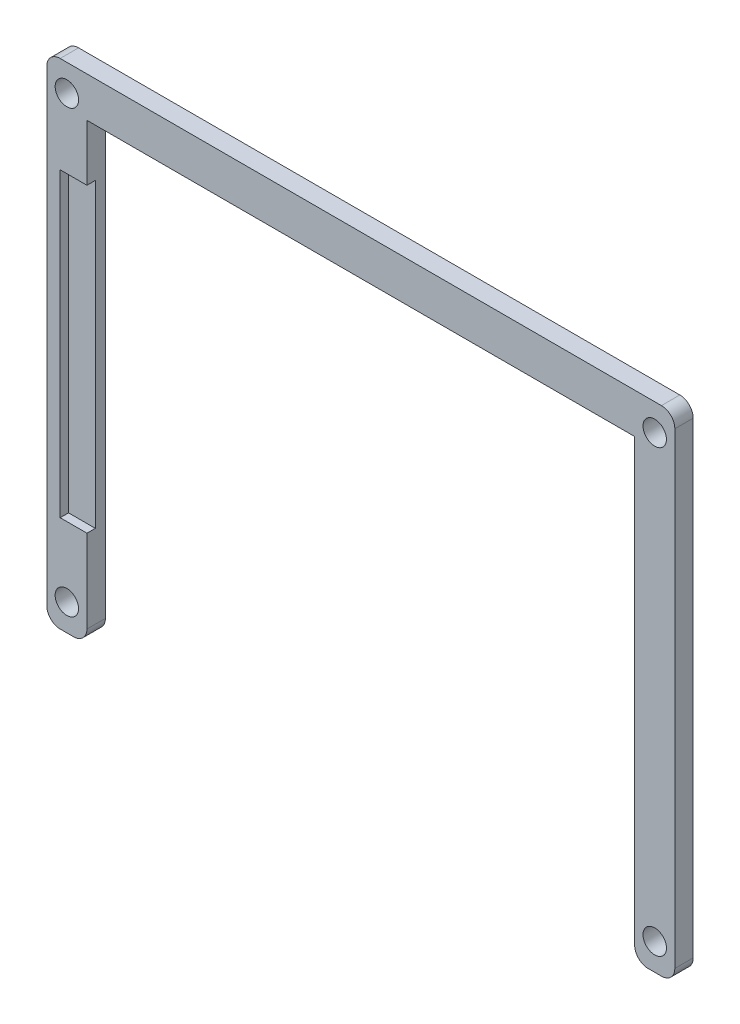
ISO-10303-21;
HEADER;
FILE_DESCRIPTION(('STEP AP214'),'2;1');
FILE_NAME('part.step','',(''),(''),'','','');
FILE_SCHEMA(('AUTOMOTIVE_DESIGN { 1 0 10303 214 1 1 1 1 }'));
ENDSEC;
DATA;
#1=APPLICATION_CONTEXT('core data for automotive mechanical design processes');
#2=APPLICATION_PROTOCOL_DEFINITION('international standard','automotive_design',2000,#1);
#3=PRODUCT_CONTEXT('',#1,'mechanical');
#4=PRODUCT('Part','Part','',(#3));
#5=PRODUCT_RELATED_PRODUCT_CATEGORY('part','',(#4));
#6=PRODUCT_DEFINITION_FORMATION('','',#4);
#7=PRODUCT_DEFINITION_CONTEXT('part definition',#1,'design');
#8=PRODUCT_DEFINITION('design','',#6,#7);
#9=PRODUCT_DEFINITION_SHAPE('','',#8);
#10=(LENGTH_UNIT() NAMED_UNIT(*) SI_UNIT(.MILLI.,.METRE.));
#11=(NAMED_UNIT(*) PLANE_ANGLE_UNIT() SI_UNIT($,.RADIAN.));
#12=(NAMED_UNIT(*) SI_UNIT($,.STERADIAN.) SOLID_ANGLE_UNIT());
#13=UNCERTAINTY_MEASURE_WITH_UNIT(LENGTH_MEASURE(1.E-05),#10,'distance_accuracy_value','');
#14=(GEOMETRIC_REPRESENTATION_CONTEXT(3) GLOBAL_UNCERTAINTY_ASSIGNED_CONTEXT((#13)) GLOBAL_UNIT_ASSIGNED_CONTEXT((#10,
#11,#12)) REPRESENTATION_CONTEXT('',''));
#15=CARTESIAN_POINT('',(0.,0.,0.));
#16=DIRECTION('',(0.,0.,1.));
#17=DIRECTION('',(1.,0.,0.));
#18=AXIS2_PLACEMENT_3D('',#15,#16,#17);
#19=CARTESIAN_POINT('',(-43.5921170964063,-113.323938617452,2.75));
#20=DIRECTION('',(0.,0.,-1.));
#21=DIRECTION('',(-1.,0.,0.));
#22=AXIS2_PLACEMENT_3D('',#19,#20,#21);
#23=PLANE('',#22);
#24=DIRECTION('',(0.,1.,0.));
#25=VECTOR('',#24,1.);
#26=CARTESIAN_POINT('',(-41.5921170964063,-47.5230805906207,2.75));
#27=LINE('',#26,#25);
#28=CARTESIAN_POINT('',(-41.5921170964063,-113.323938617452,2.75));
#29=VERTEX_POINT('',#28);
#30=CARTESIAN_POINT('',(-41.5921170964063,-100.923509604037,2.75));
#31=VERTEX_POINT('',#30);
#32=EDGE_CURVE('E57',#29,#31,#27,.T.);
#33=ORIENTED_EDGE('',*,*,#32,.T.);
#34=DIRECTION('',(1.,0.,0.));
#35=VECTOR('',#34,1.);
#36=CARTESIAN_POINT('',(-41.5921170964063,-100.923509604037,2.75));
#37=LINE('',#36,#35);
#38=CARTESIAN_POINT('',(-45.5921170964063,-100.923509604037,2.75));
#39=VERTEX_POINT('',#38);
#40=EDGE_CURVE('E294',#39,#31,#37,.T.);
#41=ORIENTED_EDGE('',*,*,#40,.F.);
#42=DIRECTION('',(0.,-1.,0.));
#43=VECTOR('',#42,1.);
#44=CARTESIAN_POINT('',(-45.5921170964063,-55.9235096040366,2.75));
#45=LINE('',#44,#43);
#46=CARTESIAN_POINT('',(-45.5921170964063,-55.9235096040366,2.75));
#47=VERTEX_POINT('',#46);
#48=EDGE_CURVE('E335',#47,#39,#45,.T.);
#49=ORIENTED_EDGE('',*,*,#48,.F.);
#50=DIRECTION('',(-1.,0.,0.));
#51=VECTOR('',#50,1.);
#52=CARTESIAN_POINT('',(-41.5921170964063,-55.9235096040366,2.75));
#53=LINE('',#52,#51);
#54=CARTESIAN_POINT('',(-41.5921170964063,-55.9235096040366,2.75));
#55=VERTEX_POINT('',#54);
#56=EDGE_CURVE('E338',#55,#47,#53,.T.);
#57=ORIENTED_EDGE('',*,*,#56,.F.);
#58=CARTESIAN_POINT('',(-41.5921170964063,-47.5230805906207,2.75));
#59=VERTEX_POINT('',#58);
#60=EDGE_CURVE('E118',#55,#59,#27,.T.);
#61=ORIENTED_EDGE('',*,*,#60,.T.);
#62=DIRECTION('',(1.,0.,0.));
#63=VECTOR('',#62,1.);
#64=CARTESIAN_POINT('',(-41.5921170964063,-47.5230805906207,2.75));
#65=LINE('',#64,#63);
#66=CARTESIAN_POINT('',(40.2078829035937,-47.5230805906207,2.75));
#67=VERTEX_POINT('',#66);
#68=EDGE_CURVE('E245',#59,#67,#65,.T.);
#69=ORIENTED_EDGE('',*,*,#68,.T.);
#70=DIRECTION('',(0.,-1.,0.));
#71=VECTOR('',#70,1.);
#72=CARTESIAN_POINT('',(40.2078829035937,-47.5230805906207,2.75));
#73=LINE('',#72,#71);
#74=CARTESIAN_POINT('',(40.2078829035937,-113.323938617452,2.75));
#75=VERTEX_POINT('',#74);
#76=EDGE_CURVE('E243',#67,#75,#73,.T.);
#77=ORIENTED_EDGE('',*,*,#76,.T.);
#78=CARTESIAN_POINT('',(42.2078829035937,-113.323938617452,2.75));
#79=DIRECTION('',(0.,0.,1.));
#80=DIRECTION('',(-1.,0.,0.));
#81=AXIS2_PLACEMENT_3D('',#78,#79,#80);
#82=CIRCLE('',#81,2.);
#83=CARTESIAN_POINT('',(42.2078829035937,-115.323938617452,2.75));
#84=VERTEX_POINT('',#83);
#85=EDGE_CURVE('E266',#75,#84,#82,.T.);
#86=ORIENTED_EDGE('',*,*,#85,.T.);
#87=DIRECTION('',(1.,0.,0.));
#88=VECTOR('',#87,1.);
#89=CARTESIAN_POINT('',(42.2078829035937,-115.323938617452,2.75));
#90=LINE('',#89,#88);
#91=CARTESIAN_POINT('',(44.2078829035937,-115.323938617452,2.75));
#92=VERTEX_POINT('',#91);
#93=EDGE_CURVE('E263',#84,#92,#90,.T.);
#94=ORIENTED_EDGE('',*,*,#93,.T.);
#95=CARTESIAN_POINT('',(44.2078829035937,-113.323938617452,2.75));
#96=DIRECTION('',(0.,0.,1.));
#97=DIRECTION('',(-1.,0.,0.));
#98=AXIS2_PLACEMENT_3D('',#95,#96,#97);
#99=CIRCLE('',#98,2.);
#100=CARTESIAN_POINT('',(46.2078829035937,-113.323938617452,2.75));
#101=VERTEX_POINT('',#100);
#102=EDGE_CURVE('E265',#92,#101,#99,.T.);
#103=ORIENTED_EDGE('',*,*,#102,.T.);
#104=DIRECTION('',(0.,1.,0.));
#105=VECTOR('',#104,1.);
#106=CARTESIAN_POINT('',(46.2078829035937,-43.5230805906207,2.75));
#107=LINE('',#106,#105);
#108=CARTESIAN_POINT('',(46.2078829035937,-43.5230805906207,2.75));
#109=VERTEX_POINT('',#108);
#110=EDGE_CURVE('E268',#101,#109,#107,.T.);
#111=ORIENTED_EDGE('',*,*,#110,.T.);
#112=CARTESIAN_POINT('',(44.2078829035937,-43.5230805906207,2.75));
#113=DIRECTION('',(0.,0.,1.));
#114=DIRECTION('',(-1.,0.,0.));
#115=AXIS2_PLACEMENT_3D('',#112,#113,#114);
#116=CIRCLE('',#115,2.);
#117=CARTESIAN_POINT('',(44.2078829035937,-41.5230805906207,2.75));
#118=VERTEX_POINT('',#117);
#119=EDGE_CURVE('E274',#109,#118,#116,.T.);
#120=ORIENTED_EDGE('',*,*,#119,.T.);
#121=DIRECTION('',(-1.,0.,0.));
#122=VECTOR('',#121,1.);
#123=CARTESIAN_POINT('',(-45.5921170964063,-41.5230805906207,2.75));
#124=LINE('',#123,#122);
#125=CARTESIAN_POINT('',(-45.5921170964063,-41.5230805906207,2.75));
#126=VERTEX_POINT('',#125);
#127=EDGE_CURVE('E276',#118,#126,#124,.T.);
#128=ORIENTED_EDGE('',*,*,#127,.T.);
#129=CARTESIAN_POINT('',(-45.5921170964063,-43.5230805906207,2.75));
#130=DIRECTION('',(0.,0.,1.));
#131=DIRECTION('',(1.,0.,0.));
#132=AXIS2_PLACEMENT_3D('',#129,#130,#131);
#133=CIRCLE('',#132,2.);
#134=CARTESIAN_POINT('',(-47.5921170964063,-43.5230805906207,2.75));
#135=VERTEX_POINT('',#134);
#136=EDGE_CURVE('E278',#126,#135,#133,.T.);
#137=ORIENTED_EDGE('',*,*,#136,.T.);
#138=DIRECTION('',(0.,-1.,0.));
#139=VECTOR('',#138,1.);
#140=CARTESIAN_POINT('',(-47.5921170964063,-43.5230805906207,2.75));
#141=LINE('',#140,#139);
#142=CARTESIAN_POINT('',(-47.5921170964063,-113.323938617452,2.75));
#143=VERTEX_POINT('',#142);
#144=EDGE_CURVE('E160',#135,#143,#141,.T.);
#145=ORIENTED_EDGE('',*,*,#144,.T.);
#146=CARTESIAN_POINT('',(-45.5921170964063,-113.323938617452,2.75));
#147=DIRECTION('',(0.,0.,1.));
#148=DIRECTION('',(1.,0.,0.));
#149=AXIS2_PLACEMENT_3D('',#146,#147,#148);
#150=CIRCLE('',#149,2.00000000000001);
#151=CARTESIAN_POINT('',(-45.5921170964063,-115.323938617452,2.75));
#152=VERTEX_POINT('',#151);
#153=EDGE_CURVE('E153',#143,#152,#150,.T.);
#154=ORIENTED_EDGE('',*,*,#153,.T.);
#155=DIRECTION('',(1.,0.,0.));
#156=VECTOR('',#155,1.);
#157=CARTESIAN_POINT('',(-45.5921170964063,-115.323938617452,2.75));
#158=LINE('',#157,#156);
#159=CARTESIAN_POINT('',(-43.5921170964063,-115.323938617452,2.75));
#160=VERTEX_POINT('',#159);
#161=EDGE_CURVE('E157',#152,#160,#158,.T.);
#162=ORIENTED_EDGE('',*,*,#161,.T.);
#163=CARTESIAN_POINT('',(-43.5921170964063,-113.323938617452,2.75));
#164=DIRECTION('',(0.,0.,1.));
#165=DIRECTION('',(-1.,0.,0.));
#166=AXIS2_PLACEMENT_3D('',#163,#164,#165);
#167=CIRCLE('',#166,2.00000000000001);
#168=EDGE_CURVE('E177',#160,#29,#167,.T.);
#169=ORIENTED_EDGE('',*,*,#168,.T.);
#170=EDGE_LOOP('',(#33,#41,#49,#57,#61,#69,#77,#86,#94,#103,#111,#120,#128,#137,#145,#154,#162,#169));
#171=FACE_BOUND('',#170,.T.);
#172=CARTESIAN_POINT('',(-44.5921170964063,-45.5239386174524,2.75));
#173=DIRECTION('',(0.,0.,1.));
#174=DIRECTION('',(1.,0.,0.));
#175=AXIS2_PLACEMENT_3D('',#172,#173,#174);
#176=CIRCLE('',#175,1.75);
#177=CARTESIAN_POINT('',(-42.8421170964063,-45.5239386174524,2.75));
#178=VERTEX_POINT('',#177);
#179=EDGE_CURVE('E187',#178,#178,#176,.T.);
#180=ORIENTED_EDGE('',*,*,#179,.F.);
#181=EDGE_LOOP('',(#180));
#182=FACE_BOUND('',#181,.T.);
#183=CARTESIAN_POINT('',(43.2078829035937,-45.5239386174524,2.75));
#184=DIRECTION('',(0.,0.,1.));
#185=DIRECTION('',(1.,0.,0.));
#186=AXIS2_PLACEMENT_3D('',#183,#184,#185);
#187=CIRCLE('',#186,1.75);
#188=CARTESIAN_POINT('',(44.9578829035937,-45.5239386174524,2.75));
#189=VERTEX_POINT('',#188);
#190=EDGE_CURVE('E302',#189,#189,#187,.T.);
#191=ORIENTED_EDGE('',*,*,#190,.F.);
#192=EDGE_LOOP('',(#191));
#193=FACE_BOUND('',#192,.T.);
#194=CARTESIAN_POINT('',(43.2078829035937,-111.323938617452,2.75));
#195=DIRECTION('',(0.,0.,1.));
#196=DIRECTION('',(1.,0.,0.));
#197=AXIS2_PLACEMENT_3D('',#194,#195,#196);
#198=CIRCLE('',#197,1.75);
#199=CARTESIAN_POINT('',(44.9578829035937,-111.323938617452,2.75));
#200=VERTEX_POINT('',#199);
#201=EDGE_CURVE('E308',#200,#200,#198,.T.);
#202=ORIENTED_EDGE('',*,*,#201,.F.);
#203=EDGE_LOOP('',(#202));
#204=FACE_BOUND('',#203,.T.);
#205=CARTESIAN_POINT('',(-44.5921170964063,-111.323938617452,2.75));
#206=DIRECTION('',(0.,0.,1.));
#207=DIRECTION('',(1.,0.,0.));
#208=AXIS2_PLACEMENT_3D('',#205,#206,#207);
#209=CIRCLE('',#208,1.75);
#210=CARTESIAN_POINT('',(-42.8421170964063,-111.323938617452,2.75));
#211=VERTEX_POINT('',#210);
#212=EDGE_CURVE('E314',#211,#211,#209,.T.);
#213=ORIENTED_EDGE('',*,*,#212,.F.);
#214=EDGE_LOOP('',(#213));
#215=FACE_BOUND('',#214,.T.);
#216=ADVANCED_FACE('F33',(#171,#182,#193,#204,#215),#23,.F.);
#217=CARTESIAN_POINT('',(-43.5921170964063,-113.323938617452,0.));
#218=DIRECTION('',(0.,0.,-1.));
#219=DIRECTION('',(-1.,0.,0.));
#220=AXIS2_PLACEMENT_3D('',#217,#218,#219);
#221=PLANE('',#220);
#222=CARTESIAN_POINT('',(43.2078829035937,-111.323938617452,0.));
#223=DIRECTION('',(0.,0.,1.));
#224=DIRECTION('',(1.,0.,0.));
#225=AXIS2_PLACEMENT_3D('',#222,#223,#224);
#226=CIRCLE('',#225,1.75);
#227=CARTESIAN_POINT('',(44.9578829035937,-111.323938617452,0.));
#228=VERTEX_POINT('',#227);
#229=EDGE_CURVE('E311',#228,#228,#226,.T.);
#230=ORIENTED_EDGE('',*,*,#229,.T.);
#231=EDGE_LOOP('',(#230));
#232=FACE_BOUND('',#231,.T.);
#233=CARTESIAN_POINT('',(-44.5921170964063,-45.5239386174524,0.));
#234=DIRECTION('',(0.,0.,1.));
#235=DIRECTION('',(1.,0.,0.));
#236=AXIS2_PLACEMENT_3D('',#233,#234,#235);
#237=CIRCLE('',#236,1.75);
#238=CARTESIAN_POINT('',(-42.8421170964063,-45.5239386174524,0.));
#239=VERTEX_POINT('',#238);
#240=EDGE_CURVE('E299',#239,#239,#237,.T.);
#241=ORIENTED_EDGE('',*,*,#240,.T.);
#242=EDGE_LOOP('',(#241));
#243=FACE_BOUND('',#242,.T.);
#244=DIRECTION('',(1.,0.,0.));
#245=VECTOR('',#244,1.);
#246=CARTESIAN_POINT('',(-41.5921170964063,-47.5230805906207,0.));
#247=LINE('',#246,#245);
#248=CARTESIAN_POINT('',(-41.5921170964063,-47.5230805906207,0.));
#249=VERTEX_POINT('',#248);
#250=CARTESIAN_POINT('',(40.2078829035937,-47.5230805906207,0.));
#251=VERTEX_POINT('',#250);
#252=EDGE_CURVE('E183',#249,#251,#247,.T.);
#253=ORIENTED_EDGE('',*,*,#252,.F.);
#254=DIRECTION('',(0.,1.,0.));
#255=VECTOR('',#254,1.);
#256=CARTESIAN_POINT('',(-41.5921170964063,-107.97555157257,0.));
#257=LINE('',#256,#255);
#258=CARTESIAN_POINT('',(-41.5921170964063,-113.323938617452,0.));
#259=VERTEX_POINT('',#258);
#260=EDGE_CURVE('E209',#259,#249,#257,.T.);
#261=ORIENTED_EDGE('',*,*,#260,.F.);
#262=CARTESIAN_POINT('',(-43.5921170964063,-113.323938617452,0.));
#263=DIRECTION('',(0.,0.,1.));
#264=DIRECTION('',(-1.,0.,0.));
#265=AXIS2_PLACEMENT_3D('',#262,#263,#264);
#266=CIRCLE('',#265,2.00000000000001);
#267=CARTESIAN_POINT('',(-43.5921170964063,-115.323938617452,0.));
#268=VERTEX_POINT('',#267);
#269=EDGE_CURVE('E110',#268,#259,#266,.T.);
#270=ORIENTED_EDGE('',*,*,#269,.F.);
#271=DIRECTION('',(1.,0.,0.));
#272=VECTOR('',#271,1.);
#273=CARTESIAN_POINT('',(-45.5921170964063,-115.323938617452,0.));
#274=LINE('',#273,#272);
#275=CARTESIAN_POINT('',(-45.5921170964063,-115.323938617452,0.));
#276=VERTEX_POINT('',#275);
#277=EDGE_CURVE('E206',#276,#268,#274,.T.);
#278=ORIENTED_EDGE('',*,*,#277,.F.);
#279=CARTESIAN_POINT('',(-45.5921170964063,-113.323938617452,0.));
#280=DIRECTION('',(0.,0.,1.));
#281=DIRECTION('',(1.,0.,0.));
#282=AXIS2_PLACEMENT_3D('',#279,#280,#281);
#283=CIRCLE('',#282,2.00000000000001);
#284=CARTESIAN_POINT('',(-47.5921170964063,-113.323938617452,0.));
#285=VERTEX_POINT('',#284);
#286=EDGE_CURVE('E169',#285,#276,#283,.T.);
#287=ORIENTED_EDGE('',*,*,#286,.F.);
#288=DIRECTION('',(0.,-1.,0.));
#289=VECTOR('',#288,1.);
#290=CARTESIAN_POINT('',(-47.5921170964063,-43.5230805906207,0.));
#291=LINE('',#290,#289);
#292=CARTESIAN_POINT('',(-47.5921170964063,-43.5230805906207,0.));
#293=VERTEX_POINT('',#292);
#294=EDGE_CURVE('E203',#293,#285,#291,.T.);
#295=ORIENTED_EDGE('',*,*,#294,.F.);
#296=CARTESIAN_POINT('',(-45.5921170964063,-43.5230805906207,0.));
#297=DIRECTION('',(0.,0.,1.));
#298=DIRECTION('',(1.,0.,0.));
#299=AXIS2_PLACEMENT_3D('',#296,#297,#298);
#300=CIRCLE('',#299,2.);
#301=CARTESIAN_POINT('',(-45.5921170964063,-41.5230805906207,0.));
#302=VERTEX_POINT('',#301);
#303=EDGE_CURVE('E201',#302,#293,#300,.T.);
#304=ORIENTED_EDGE('',*,*,#303,.F.);
#305=DIRECTION('',(-1.,0.,0.));
#306=VECTOR('',#305,1.);
#307=CARTESIAN_POINT('',(-45.5921170964063,-41.5230805906207,0.));
#308=LINE('',#307,#306);
#309=CARTESIAN_POINT('',(44.2078829035937,-41.5230805906207,0.));
#310=VERTEX_POINT('',#309);
#311=EDGE_CURVE('E199',#310,#302,#308,.T.);
#312=ORIENTED_EDGE('',*,*,#311,.F.);
#313=CARTESIAN_POINT('',(44.2078829035937,-43.5230805906207,0.));
#314=DIRECTION('',(0.,0.,1.));
#315=DIRECTION('',(-1.,0.,0.));
#316=AXIS2_PLACEMENT_3D('',#313,#314,#315);
#317=CIRCLE('',#316,2.);
#318=CARTESIAN_POINT('',(46.2078829035937,-43.5230805906207,0.));
#319=VERTEX_POINT('',#318);
#320=EDGE_CURVE('E197',#319,#310,#317,.T.);
#321=ORIENTED_EDGE('',*,*,#320,.F.);
#322=DIRECTION('',(0.,1.,0.));
#323=VECTOR('',#322,1.);
#324=CARTESIAN_POINT('',(46.2078829035937,-43.5230805906207,0.));
#325=LINE('',#324,#323);
#326=CARTESIAN_POINT('',(46.2078829035937,-113.323938617452,0.));
#327=VERTEX_POINT('',#326);
#328=EDGE_CURVE('E195',#327,#319,#325,.T.);
#329=ORIENTED_EDGE('',*,*,#328,.F.);
#330=CARTESIAN_POINT('',(44.2078829035937,-113.323938617452,0.));
#331=DIRECTION('',(0.,0.,1.));
#332=DIRECTION('',(-1.,0.,0.));
#333=AXIS2_PLACEMENT_3D('',#330,#331,#332);
#334=CIRCLE('',#333,2.);
#335=CARTESIAN_POINT('',(44.2078829035937,-115.323938617452,0.));
#336=VERTEX_POINT('',#335);
#337=EDGE_CURVE('E193',#336,#327,#334,.T.);
#338=ORIENTED_EDGE('',*,*,#337,.F.);
#339=DIRECTION('',(1.,0.,0.));
#340=VECTOR('',#339,1.);
#341=CARTESIAN_POINT('',(42.2078829035937,-115.323938617452,0.));
#342=LINE('',#341,#340);
#343=CARTESIAN_POINT('',(42.2078829035937,-115.323938617452,0.));
#344=VERTEX_POINT('',#343);
#345=EDGE_CURVE('E191',#344,#336,#342,.T.);
#346=ORIENTED_EDGE('',*,*,#345,.F.);
#347=CARTESIAN_POINT('',(42.2078829035937,-113.323938617452,0.));
#348=DIRECTION('',(0.,0.,1.));
#349=DIRECTION('',(-1.,0.,0.));
#350=AXIS2_PLACEMENT_3D('',#347,#348,#349);
#351=CIRCLE('',#350,2.);
#352=CARTESIAN_POINT('',(40.2078829035937,-113.323938617452,0.));
#353=VERTEX_POINT('',#352);
#354=EDGE_CURVE('E189',#353,#344,#351,.T.);
#355=ORIENTED_EDGE('',*,*,#354,.F.);
#356=DIRECTION('',(0.,-1.,0.));
#357=VECTOR('',#356,1.);
#358=CARTESIAN_POINT('',(40.2078829035937,-107.97555157257,0.));
#359=LINE('',#358,#357);
#360=EDGE_CURVE('E186',#251,#353,#359,.T.);
#361=ORIENTED_EDGE('',*,*,#360,.F.);
#362=EDGE_LOOP('',(#253,#261,#270,#278,#287,#295,#304,#312,#321,#329,#338,#346,#355,#361));
#363=FACE_BOUND('',#362,.T.);
#364=CARTESIAN_POINT('',(43.2078829035937,-45.5239386174524,0.));
#365=DIRECTION('',(0.,0.,1.));
#366=DIRECTION('',(1.,0.,0.));
#367=AXIS2_PLACEMENT_3D('',#364,#365,#366);
#368=CIRCLE('',#367,1.75);
#369=CARTESIAN_POINT('',(44.9578829035937,-45.5239386174524,0.));
#370=VERTEX_POINT('',#369);
#371=EDGE_CURVE('E305',#370,#370,#368,.T.);
#372=ORIENTED_EDGE('',*,*,#371,.T.);
#373=EDGE_LOOP('',(#372));
#374=FACE_BOUND('',#373,.T.);
#375=CARTESIAN_POINT('',(-44.5921170964063,-111.323938617452,0.));
#376=DIRECTION('',(0.,0.,1.));
#377=DIRECTION('',(1.,0.,0.));
#378=AXIS2_PLACEMENT_3D('',#375,#376,#377);
#379=CIRCLE('',#378,1.75);
#380=CARTESIAN_POINT('',(-42.8421170964063,-111.323938617452,0.));
#381=VERTEX_POINT('',#380);
#382=EDGE_CURVE('E317',#381,#381,#379,.T.);
#383=ORIENTED_EDGE('',*,*,#382,.T.);
#384=EDGE_LOOP('',(#383));
#385=FACE_BOUND('',#384,.T.);
#386=ADVANCED_FACE('F250',(#232,#243,#363,#374,#385),#221,.T.);
#387=CARTESIAN_POINT('',(-41.5921170964063,-47.5230805906207,2.75));
#388=DIRECTION('',(0.,1.,0.));
#389=DIRECTION('',(0.,0.,1.));
#390=AXIS2_PLACEMENT_3D('',#387,#388,#389);
#391=PLANE('',#390);
#392=ORIENTED_EDGE('',*,*,#252,.T.);
#393=DIRECTION('',(0.,0.,-1.));
#394=VECTOR('',#393,1.);
#395=CARTESIAN_POINT('',(40.2078829035937,-47.5230805906207,2.75));
#396=LINE('',#395,#394);
#397=EDGE_CURVE('E41',#67,#251,#396,.T.);
#398=ORIENTED_EDGE('',*,*,#397,.F.);
#399=ORIENTED_EDGE('',*,*,#68,.F.);
#400=DIRECTION('',(0.,0.,-1.));
#401=VECTOR('',#400,1.);
#402=CARTESIAN_POINT('',(-41.5921170964063,-47.5230805906207,2.75));
#403=LINE('',#402,#401);
#404=EDGE_CURVE('E11',#59,#249,#403,.T.);
#405=ORIENTED_EDGE('',*,*,#404,.T.);
#406=EDGE_LOOP('',(#392,#398,#399,#405));
#407=FACE_BOUND('',#406,.T.);
#408=ADVANCED_FACE('F35',(#407),#391,.F.);
#409=CARTESIAN_POINT('',(40.2078829035937,-107.97555157257,2.75));
#410=DIRECTION('',(1.,0.,0.));
#411=DIRECTION('',(0.,0.,-1.));
#412=AXIS2_PLACEMENT_3D('',#409,#410,#411);
#413=PLANE('',#412);
#414=ORIENTED_EDGE('',*,*,#360,.T.);
#415=DIRECTION('',(0.,0.,-1.));
#416=VECTOR('',#415,1.);
#417=CARTESIAN_POINT('',(40.2078829035937,-113.323938617452,2.75));
#418=LINE('',#417,#416);
#419=EDGE_CURVE('E235',#75,#353,#418,.T.);
#420=ORIENTED_EDGE('',*,*,#419,.F.);
#421=ORIENTED_EDGE('',*,*,#76,.F.);
#422=ORIENTED_EDGE('',*,*,#397,.T.);
#423=EDGE_LOOP('',(#414,#420,#421,#422));
#424=FACE_BOUND('',#423,.T.);
#425=ADVANCED_FACE('F241',(#424),#413,.F.);
#426=CARTESIAN_POINT('',(42.2078829035937,-113.323938617452,2.75));
#427=DIRECTION('',(0.,0.,-1.));
#428=DIRECTION('',(-1.,0.,0.));
#429=AXIS2_PLACEMENT_3D('',#426,#427,#428);
#430=CYLINDRICAL_SURFACE('',#429,2.);
#431=ORIENTED_EDGE('',*,*,#354,.T.);
#432=DIRECTION('',(0.,0.,-1.));
#433=VECTOR('',#432,1.);
#434=CARTESIAN_POINT('',(42.2078829035937,-115.323938617452,2.75));
#435=LINE('',#434,#433);
#436=EDGE_CURVE('E232',#84,#344,#435,.T.);
#437=ORIENTED_EDGE('',*,*,#436,.F.);
#438=ORIENTED_EDGE('',*,*,#85,.F.);
#439=ORIENTED_EDGE('',*,*,#419,.T.);
#440=EDGE_LOOP('',(#431,#437,#438,#439));
#441=FACE_BOUND('',#440,.T.);
#442=ADVANCED_FACE('F257',(#441),#430,.T.);
#443=CARTESIAN_POINT('',(42.2078829035937,-115.323938617452,2.75));
#444=DIRECTION('',(0.,1.,0.));
#445=DIRECTION('',(0.,0.,1.));
#446=AXIS2_PLACEMENT_3D('',#443,#444,#445);
#447=PLANE('',#446);
#448=ORIENTED_EDGE('',*,*,#345,.T.);
#449=DIRECTION('',(0.,0.,-1.));
#450=VECTOR('',#449,1.);
#451=CARTESIAN_POINT('',(44.2078829035937,-115.323938617452,2.75));
#452=LINE('',#451,#450);
#453=EDGE_CURVE('E229',#92,#336,#452,.T.);
#454=ORIENTED_EDGE('',*,*,#453,.F.);
#455=ORIENTED_EDGE('',*,*,#93,.F.);
#456=ORIENTED_EDGE('',*,*,#436,.T.);
#457=EDGE_LOOP('',(#448,#454,#455,#456));
#458=FACE_BOUND('',#457,.T.);
#459=ADVANCED_FACE('F261',(#458),#447,.F.);
#460=CARTESIAN_POINT('',(44.2078829035937,-113.323938617452,2.75));
#461=DIRECTION('',(0.,0.,-1.));
#462=DIRECTION('',(-1.,0.,0.));
#463=AXIS2_PLACEMENT_3D('',#460,#461,#462);
#464=CYLINDRICAL_SURFACE('',#463,2.);
#465=ORIENTED_EDGE('',*,*,#337,.T.);
#466=DIRECTION('',(0.,0.,-1.));
#467=VECTOR('',#466,1.);
#468=CARTESIAN_POINT('',(46.2078829035937,-113.323938617452,2.75));
#469=LINE('',#468,#467);
#470=EDGE_CURVE('E226',#101,#327,#469,.T.);
#471=ORIENTED_EDGE('',*,*,#470,.F.);
#472=ORIENTED_EDGE('',*,*,#102,.F.);
#473=ORIENTED_EDGE('',*,*,#453,.T.);
#474=EDGE_LOOP('',(#465,#471,#472,#473));
#475=FACE_BOUND('',#474,.T.);
#476=ADVANCED_FACE('F415',(#475),#464,.T.);
#477=CARTESIAN_POINT('',(46.2078829035937,-43.5230805906207,2.75));
#478=DIRECTION('',(-1.,0.,0.));
#479=DIRECTION('',(0.,-1.,0.));
#480=AXIS2_PLACEMENT_3D('',#477,#478,#479);
#481=PLANE('',#480);
#482=ORIENTED_EDGE('',*,*,#328,.T.);
#483=DIRECTION('',(0.,0.,-1.));
#484=VECTOR('',#483,1.);
#485=CARTESIAN_POINT('',(46.2078829035937,-43.5230805906207,2.75));
#486=LINE('',#485,#484);
#487=EDGE_CURVE('E223',#109,#319,#486,.T.);
#488=ORIENTED_EDGE('',*,*,#487,.F.);
#489=ORIENTED_EDGE('',*,*,#110,.F.);
#490=ORIENTED_EDGE('',*,*,#470,.T.);
#491=EDGE_LOOP('',(#482,#488,#489,#490));
#492=FACE_BOUND('',#491,.T.);
#493=ADVANCED_FACE('F411',(#492),#481,.F.);
#494=CARTESIAN_POINT('',(44.2078829035937,-43.5230805906207,2.75));
#495=DIRECTION('',(0.,0.,-1.));
#496=DIRECTION('',(-1.,0.,0.));
#497=AXIS2_PLACEMENT_3D('',#494,#495,#496);
#498=CYLINDRICAL_SURFACE('',#497,2.);
#499=ORIENTED_EDGE('',*,*,#320,.T.);
#500=DIRECTION('',(0.,0.,-1.));
#501=VECTOR('',#500,1.);
#502=CARTESIAN_POINT('',(44.2078829035937,-41.5230805906207,2.75));
#503=LINE('',#502,#501);
#504=EDGE_CURVE('E220',#118,#310,#503,.T.);
#505=ORIENTED_EDGE('',*,*,#504,.F.);
#506=ORIENTED_EDGE('',*,*,#119,.F.);
#507=ORIENTED_EDGE('',*,*,#487,.T.);
#508=EDGE_LOOP('',(#499,#505,#506,#507));
#509=FACE_BOUND('',#508,.T.);
#510=ADVANCED_FACE('F407',(#509),#498,.T.);
#511=CARTESIAN_POINT('',(-45.5921170964063,-41.5230805906207,2.75));
#512=DIRECTION('',(0.,-1.,0.));
#513=DIRECTION('',(0.,0.,-1.));
#514=AXIS2_PLACEMENT_3D('',#511,#512,#513);
#515=PLANE('',#514);
#516=ORIENTED_EDGE('',*,*,#311,.T.);
#517=DIRECTION('',(0.,0.,-1.));
#518=VECTOR('',#517,1.);
#519=CARTESIAN_POINT('',(-45.5921170964063,-41.5230805906207,2.75));
#520=LINE('',#519,#518);
#521=EDGE_CURVE('E217',#126,#302,#520,.T.);
#522=ORIENTED_EDGE('',*,*,#521,.F.);
#523=ORIENTED_EDGE('',*,*,#127,.F.);
#524=ORIENTED_EDGE('',*,*,#504,.T.);
#525=EDGE_LOOP('',(#516,#522,#523,#524));
#526=FACE_BOUND('',#525,.T.);
#527=ADVANCED_FACE('F404',(#526),#515,.F.);
#528=CARTESIAN_POINT('',(-45.5921170964063,-43.5230805906207,2.75));
#529=DIRECTION('',(0.,0.,-1.));
#530=DIRECTION('',(-1.,0.,0.));
#531=AXIS2_PLACEMENT_3D('',#528,#529,#530);
#532=CYLINDRICAL_SURFACE('',#531,2.);
#533=ORIENTED_EDGE('',*,*,#303,.T.);
#534=DIRECTION('',(0.,0.,-1.));
#535=VECTOR('',#534,1.);
#536=CARTESIAN_POINT('',(-47.5921170964063,-43.5230805906207,2.75));
#537=LINE('',#536,#535);
#538=EDGE_CURVE('E214',#135,#293,#537,.T.);
#539=ORIENTED_EDGE('',*,*,#538,.F.);
#540=ORIENTED_EDGE('',*,*,#136,.F.);
#541=ORIENTED_EDGE('',*,*,#521,.T.);
#542=EDGE_LOOP('',(#533,#539,#540,#541));
#543=FACE_BOUND('',#542,.T.);
#544=ADVANCED_FACE('F284',(#543),#532,.T.);
#545=CARTESIAN_POINT('',(-47.5921170964063,-43.5230805906207,2.75));
#546=DIRECTION('',(1.,0.,0.));
#547=DIRECTION('',(0.,1.,0.));
#548=AXIS2_PLACEMENT_3D('',#545,#546,#547);
#549=PLANE('',#548);
#550=ORIENTED_EDGE('',*,*,#294,.T.);
#551=DIRECTION('',(0.,0.,-1.));
#552=VECTOR('',#551,1.);
#553=CARTESIAN_POINT('',(-47.5921170964063,-113.323938617452,2.75));
#554=LINE('',#553,#552);
#555=EDGE_CURVE('E172',#143,#285,#554,.T.);
#556=ORIENTED_EDGE('',*,*,#555,.F.);
#557=ORIENTED_EDGE('',*,*,#144,.F.);
#558=ORIENTED_EDGE('',*,*,#538,.T.);
#559=EDGE_LOOP('',(#550,#556,#557,#558));
#560=FACE_BOUND('',#559,.T.);
#561=ADVANCED_FACE('F288',(#560),#549,.F.);
#562=CARTESIAN_POINT('',(-45.5921170964063,-113.323938617452,2.75));
#563=DIRECTION('',(0.,0.,-1.));
#564=DIRECTION('',(-1.,0.,0.));
#565=AXIS2_PLACEMENT_3D('',#562,#563,#564);
#566=CYLINDRICAL_SURFACE('',#565,2.00000000000001);
#567=ORIENTED_EDGE('',*,*,#286,.T.);
#568=DIRECTION('',(0.,0.,-1.));
#569=VECTOR('',#568,1.);
#570=CARTESIAN_POINT('',(-45.5921170964063,-115.323938617452,2.75));
#571=LINE('',#570,#569);
#572=EDGE_CURVE('E166',#152,#276,#571,.T.);
#573=ORIENTED_EDGE('',*,*,#572,.F.);
#574=ORIENTED_EDGE('',*,*,#153,.F.);
#575=ORIENTED_EDGE('',*,*,#555,.T.);
#576=EDGE_LOOP('',(#567,#573,#574,#575));
#577=FACE_BOUND('',#576,.T.);
#578=ADVANCED_FACE('F167',(#577),#566,.T.);
#579=CARTESIAN_POINT('',(-45.5921170964063,-115.323938617452,2.75));
#580=DIRECTION('',(0.,1.,0.));
#581=DIRECTION('',(0.,0.,1.));
#582=AXIS2_PLACEMENT_3D('',#579,#580,#581);
#583=PLANE('',#582);
#584=ORIENTED_EDGE('',*,*,#277,.T.);
#585=DIRECTION('',(0.,0.,-1.));
#586=VECTOR('',#585,1.);
#587=CARTESIAN_POINT('',(-43.5921170964063,-115.323938617452,2.75));
#588=LINE('',#587,#586);
#589=EDGE_CURVE('E173',#160,#268,#588,.T.);
#590=ORIENTED_EDGE('',*,*,#589,.F.);
#591=ORIENTED_EDGE('',*,*,#161,.F.);
#592=ORIENTED_EDGE('',*,*,#572,.T.);
#593=EDGE_LOOP('',(#584,#590,#591,#592));
#594=FACE_BOUND('',#593,.T.);
#595=ADVANCED_FACE('F175',(#594),#583,.F.);
#596=CARTESIAN_POINT('',(-43.5921170964063,-113.323938617452,2.75));
#597=DIRECTION('',(0.,0.,-1.));
#598=DIRECTION('',(-1.,0.,0.));
#599=AXIS2_PLACEMENT_3D('',#596,#597,#598);
#600=CYLINDRICAL_SURFACE('',#599,2.00000000000001);
#601=ORIENTED_EDGE('',*,*,#269,.T.);
#602=DIRECTION('',(0.,0.,-1.));
#603=VECTOR('',#602,1.);
#604=CARTESIAN_POINT('',(-41.5921170964063,-113.323938617452,2.75));
#605=LINE('',#604,#603);
#606=EDGE_CURVE('E179',#29,#259,#605,.T.);
#607=ORIENTED_EDGE('',*,*,#606,.F.);
#608=ORIENTED_EDGE('',*,*,#168,.F.);
#609=ORIENTED_EDGE('',*,*,#589,.T.);
#610=EDGE_LOOP('',(#601,#607,#608,#609));
#611=FACE_BOUND('',#610,.T.);
#612=ADVANCED_FACE('F289',(#611),#600,.T.);
#613=CARTESIAN_POINT('',(-41.5921170964063,-107.97555157257,2.75));
#614=DIRECTION('',(-1.,0.,0.));
#615=DIRECTION('',(0.,-1.,0.));
#616=AXIS2_PLACEMENT_3D('',#613,#614,#615);
#617=PLANE('',#616);
#618=DIRECTION('',(0.,1.,0.));
#619=VECTOR('',#618,1.);
#620=CARTESIAN_POINT('',(-41.5921170964063,-55.9235096040366,1.5));
#621=LINE('',#620,#619);
#622=CARTESIAN_POINT('',(-41.5921170964063,-100.923509604037,1.5));
#623=VERTEX_POINT('',#622);
#624=CARTESIAN_POINT('',(-41.5921170964063,-55.9235096040366,1.5));
#625=VERTEX_POINT('',#624);
#626=EDGE_CURVE('E334',#623,#625,#621,.T.);
#627=ORIENTED_EDGE('',*,*,#626,.F.);
#628=DIRECTION('',(0.,0.,1.));
#629=VECTOR('',#628,1.);
#630=CARTESIAN_POINT('',(-41.5921170964063,-100.923509604037,1.5));
#631=LINE('',#630,#629);
#632=EDGE_CURVE('E320',#623,#31,#631,.T.);
#633=ORIENTED_EDGE('',*,*,#632,.T.);
#634=ORIENTED_EDGE('',*,*,#32,.F.);
#635=ORIENTED_EDGE('',*,*,#606,.T.);
#636=ORIENTED_EDGE('',*,*,#260,.T.);
#637=ORIENTED_EDGE('',*,*,#404,.F.);
#638=ORIENTED_EDGE('',*,*,#60,.F.);
#639=DIRECTION('',(0.,0.,1.));
#640=VECTOR('',#639,1.);
#641=CARTESIAN_POINT('',(-41.5921170964063,-55.9235096040366,1.5));
#642=LINE('',#641,#640);
#643=EDGE_CURVE('E323',#625,#55,#642,.T.);
#644=ORIENTED_EDGE('',*,*,#643,.F.);
#645=EDGE_LOOP('',(#627,#633,#634,#635,#636,#637,#638,#644));
#646=FACE_BOUND('',#645,.T.);
#647=ADVANCED_FACE('F353',(#646),#617,.F.);
#648=CARTESIAN_POINT('',(-44.5921170964063,-45.5239386174524,2.75));
#649=DIRECTION('',(0.,0.,-1.));
#650=DIRECTION('',(-1.,0.,0.));
#651=AXIS2_PLACEMENT_3D('',#648,#649,#650);
#652=CYLINDRICAL_SURFACE('',#651,1.75);
#653=ORIENTED_EDGE('',*,*,#179,.T.);
#654=EDGE_LOOP('',(#653));
#655=FACE_BOUND('',#654,.T.);
#656=ORIENTED_EDGE('',*,*,#240,.F.);
#657=EDGE_LOOP('',(#656));
#658=FACE_BOUND('',#657,.T.);
#659=ADVANCED_FACE('F389',(#655,#658),#652,.F.);
#660=CARTESIAN_POINT('',(43.2078829035937,-45.5239386174524,2.75));
#661=DIRECTION('',(0.,0.,-1.));
#662=DIRECTION('',(-1.,0.,0.));
#663=AXIS2_PLACEMENT_3D('',#660,#661,#662);
#664=CYLINDRICAL_SURFACE('',#663,1.75);
#665=ORIENTED_EDGE('',*,*,#190,.T.);
#666=EDGE_LOOP('',(#665));
#667=FACE_BOUND('',#666,.T.);
#668=ORIENTED_EDGE('',*,*,#371,.F.);
#669=EDGE_LOOP('',(#668));
#670=FACE_BOUND('',#669,.T.);
#671=ADVANCED_FACE('F518',(#667,#670),#664,.F.);
#672=CARTESIAN_POINT('',(43.2078829035937,-111.323938617452,2.75));
#673=DIRECTION('',(0.,0.,-1.));
#674=DIRECTION('',(-1.,0.,0.));
#675=AXIS2_PLACEMENT_3D('',#672,#673,#674);
#676=CYLINDRICAL_SURFACE('',#675,1.75);
#677=ORIENTED_EDGE('',*,*,#201,.T.);
#678=EDGE_LOOP('',(#677));
#679=FACE_BOUND('',#678,.T.);
#680=ORIENTED_EDGE('',*,*,#229,.F.);
#681=EDGE_LOOP('',(#680));
#682=FACE_BOUND('',#681,.T.);
#683=ADVANCED_FACE('F377',(#679,#682),#676,.F.);
#684=CARTESIAN_POINT('',(-44.5921170964063,-111.323938617452,2.75));
#685=DIRECTION('',(0.,0.,-1.));
#686=DIRECTION('',(-1.,0.,0.));
#687=AXIS2_PLACEMENT_3D('',#684,#685,#686);
#688=CYLINDRICAL_SURFACE('',#687,1.75);
#689=ORIENTED_EDGE('',*,*,#212,.T.);
#690=EDGE_LOOP('',(#689));
#691=FACE_BOUND('',#690,.T.);
#692=ORIENTED_EDGE('',*,*,#382,.F.);
#693=EDGE_LOOP('',(#692));
#694=FACE_BOUND('',#693,.T.);
#695=ADVANCED_FACE('F370',(#691,#694),#688,.F.);
#696=CARTESIAN_POINT('',(-41.5921170964063,-100.923509604037,1.5));
#697=DIRECTION('',(0.,-1.,0.));
#698=DIRECTION('',(1.,0.,0.));
#699=AXIS2_PLACEMENT_3D('',#696,#697,#698);
#700=PLANE('',#699);
#701=ORIENTED_EDGE('',*,*,#40,.T.);
#702=ORIENTED_EDGE('',*,*,#632,.F.);
#703=DIRECTION('',(1.,0.,0.));
#704=VECTOR('',#703,1.);
#705=CARTESIAN_POINT('',(-41.5921170964063,-100.923509604037,1.5));
#706=LINE('',#705,#704);
#707=CARTESIAN_POINT('',(-45.5921170964063,-100.923509604037,1.5));
#708=VERTEX_POINT('',#707);
#709=EDGE_CURVE('E48',#708,#623,#706,.T.);
#710=ORIENTED_EDGE('',*,*,#709,.F.);
#711=DIRECTION('',(0.,0.,1.));
#712=VECTOR('',#711,1.);
#713=CARTESIAN_POINT('',(-45.5921170964063,-100.923509604037,1.5));
#714=LINE('',#713,#712);
#715=EDGE_CURVE('E329',#708,#39,#714,.T.);
#716=ORIENTED_EDGE('',*,*,#715,.T.);
#717=EDGE_LOOP('',(#701,#702,#710,#716));
#718=FACE_BOUND('',#717,.T.);
#719=ADVANCED_FACE('F368',(#718),#700,.F.);
#720=CARTESIAN_POINT('',(-45.5921170964063,-55.9235096040366,1.5));
#721=DIRECTION('',(-1.,0.,0.));
#722=DIRECTION('',(0.,-1.,0.));
#723=AXIS2_PLACEMENT_3D('',#720,#721,#722);
#724=PLANE('',#723);
#725=ORIENTED_EDGE('',*,*,#48,.T.);
#726=ORIENTED_EDGE('',*,*,#715,.F.);
#727=DIRECTION('',(0.,-1.,0.));
#728=VECTOR('',#727,1.);
#729=CARTESIAN_POINT('',(-45.5921170964063,-55.9235096040366,1.5));
#730=LINE('',#729,#728);
#731=CARTESIAN_POINT('',(-45.5921170964063,-55.9235096040366,1.5));
#732=VERTEX_POINT('',#731);
#733=EDGE_CURVE('E342',#732,#708,#730,.T.);
#734=ORIENTED_EDGE('',*,*,#733,.F.);
#735=DIRECTION('',(0.,0.,1.));
#736=VECTOR('',#735,1.);
#737=CARTESIAN_POINT('',(-45.5921170964063,-55.9235096040366,1.5));
#738=LINE('',#737,#736);
#739=EDGE_CURVE('E326',#732,#47,#738,.T.);
#740=ORIENTED_EDGE('',*,*,#739,.T.);
#741=EDGE_LOOP('',(#725,#726,#734,#740));
#742=FACE_BOUND('',#741,.T.);
#743=ADVANCED_FACE('F363',(#742),#724,.F.);
#744=CARTESIAN_POINT('',(-41.5921170964063,-55.9235096040366,1.5));
#745=DIRECTION('',(0.,1.,0.));
#746=DIRECTION('',(-1.,0.,0.));
#747=AXIS2_PLACEMENT_3D('',#744,#745,#746);
#748=PLANE('',#747);
#749=ORIENTED_EDGE('',*,*,#56,.T.);
#750=ORIENTED_EDGE('',*,*,#739,.F.);
#751=DIRECTION('',(-1.,0.,0.));
#752=VECTOR('',#751,1.);
#753=CARTESIAN_POINT('',(-41.5921170964063,-55.9235096040366,1.5));
#754=LINE('',#753,#752);
#755=EDGE_CURVE('E344',#625,#732,#754,.T.);
#756=ORIENTED_EDGE('',*,*,#755,.F.);
#757=ORIENTED_EDGE('',*,*,#643,.T.);
#758=EDGE_LOOP('',(#749,#750,#756,#757));
#759=FACE_BOUND('',#758,.T.);
#760=ADVANCED_FACE('F356',(#759),#748,.F.);
#761=CARTESIAN_POINT('',(0.,0.,1.5));
#762=DIRECTION('',(0.,0.,-1.));
#763=DIRECTION('',(-1.,0.,0.));
#764=AXIS2_PLACEMENT_3D('',#761,#762,#763);
#765=PLANE('',#764);
#766=ORIENTED_EDGE('',*,*,#626,.T.);
#767=ORIENTED_EDGE('',*,*,#755,.T.);
#768=ORIENTED_EDGE('',*,*,#733,.T.);
#769=ORIENTED_EDGE('',*,*,#709,.T.);
#770=EDGE_LOOP('',(#766,#767,#768,#769));
#771=FACE_BOUND('',#770,.T.);
#772=ADVANCED_FACE('F349',(#771),#765,.F.);
#773=CLOSED_SHELL('',(#216,#386,#408,#425,#442,#459,#476,#493,#510,#527,#544,#561,#578,#595,
#612,#647,#659,#671,#683,#695,#719,#743,#760,#772));
#774=MANIFOLD_SOLID_BREP('B2',#773);
#775=ADVANCED_BREP_SHAPE_REPRESENTATION('',(#18,#774),#14);
#776=SHAPE_DEFINITION_REPRESENTATION(#9,#775);
ENDSEC;
END-ISO-10303-21;
